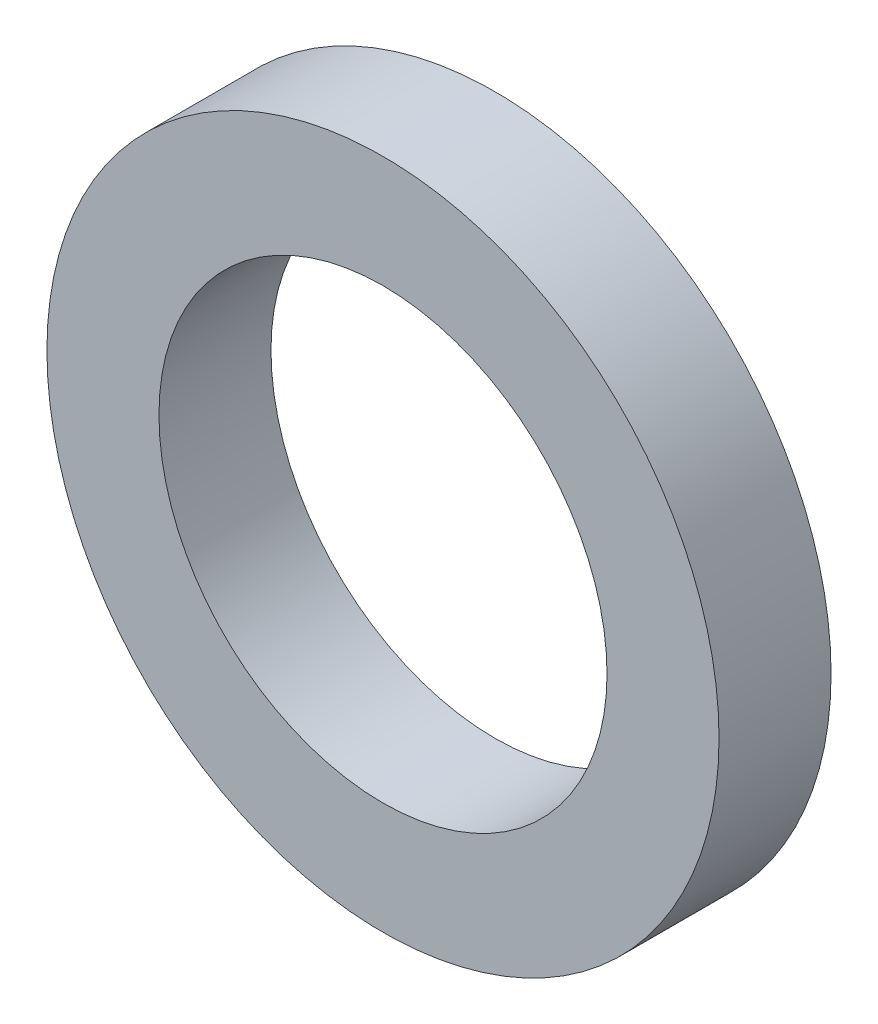
ISO-10303-21;
HEADER;
FILE_DESCRIPTION(('STEP AP214'),'2;1');
FILE_NAME('part.step','',(''),(''),'','','');
FILE_SCHEMA(('AUTOMOTIVE_DESIGN { 1 0 10303 214 1 1 1 1 }'));
ENDSEC;
DATA;
#1=APPLICATION_CONTEXT('core data for automotive mechanical design processes');
#2=APPLICATION_PROTOCOL_DEFINITION('international standard','automotive_design',2000,#1);
#3=PRODUCT_CONTEXT('',#1,'mechanical');
#4=PRODUCT('Part','Part','',(#3));
#5=PRODUCT_RELATED_PRODUCT_CATEGORY('part','',(#4));
#6=PRODUCT_DEFINITION_FORMATION('','',#4);
#7=PRODUCT_DEFINITION_CONTEXT('part definition',#1,'design');
#8=PRODUCT_DEFINITION('design','',#6,#7);
#9=PRODUCT_DEFINITION_SHAPE('','',#8);
#10=(LENGTH_UNIT() NAMED_UNIT(*) SI_UNIT(.MILLI.,.METRE.));
#11=(NAMED_UNIT(*) PLANE_ANGLE_UNIT() SI_UNIT($,.RADIAN.));
#12=(NAMED_UNIT(*) SI_UNIT($,.STERADIAN.) SOLID_ANGLE_UNIT());
#13=UNCERTAINTY_MEASURE_WITH_UNIT(LENGTH_MEASURE(1.E-05),#10,'distance_accuracy_value','');
#14=(GEOMETRIC_REPRESENTATION_CONTEXT(3) GLOBAL_UNCERTAINTY_ASSIGNED_CONTEXT((#13)) GLOBAL_UNIT_ASSIGNED_CONTEXT((#10,
#11,#12)) REPRESENTATION_CONTEXT('',''));
#15=CARTESIAN_POINT('',(0.,0.,0.));
#16=DIRECTION('',(0.,0.,1.));
#17=DIRECTION('',(1.,0.,0.));
#18=AXIS2_PLACEMENT_3D('',#15,#16,#17);
#19=CARTESIAN_POINT('',(0.,0.,6.35));
#20=DIRECTION('',(0.,0.,1.));
#21=DIRECTION('',(1.,0.,0.));
#22=AXIS2_PLACEMENT_3D('',#19,#20,#21);
#23=PLANE('',#22);
#24=CARTESIAN_POINT('',(0.,0.,6.35));
#25=DIRECTION('',(0.,0.,1.));
#26=DIRECTION('',(1.,0.,0.));
#27=AXIS2_PLACEMENT_3D('',#24,#25,#26);
#28=CIRCLE('',#27,19.05);
#29=CARTESIAN_POINT('',(19.05,0.,6.35));
#30=VERTEX_POINT('',#29);
#31=EDGE_CURVE('E10',#30,#30,#28,.T.);
#32=ORIENTED_EDGE('',*,*,#31,.T.);
#33=EDGE_LOOP('',(#32));
#34=FACE_BOUND('',#33,.T.);
#35=CARTESIAN_POINT('',(0.,0.,6.35));
#36=DIRECTION('',(0.,0.,1.));
#37=DIRECTION('',(1.,0.,0.));
#38=AXIS2_PLACEMENT_3D('',#35,#36,#37);
#39=CIRCLE('',#38,12.7);
#40=CARTESIAN_POINT('',(12.7,0.,6.35));
#41=VERTEX_POINT('',#40);
#42=EDGE_CURVE('E42',#41,#41,#39,.T.);
#43=ORIENTED_EDGE('',*,*,#42,.F.);
#44=EDGE_LOOP('',(#43));
#45=FACE_BOUND('',#44,.T.);
#46=ADVANCED_FACE('F31',(#34,#45),#23,.T.);
#47=CARTESIAN_POINT('',(0.,0.,0.));
#48=DIRECTION('',(0.,0.,1.));
#49=DIRECTION('',(1.,0.,0.));
#50=AXIS2_PLACEMENT_3D('',#47,#48,#49);
#51=PLANE('',#50);
#52=CARTESIAN_POINT('',(0.,0.,0.));
#53=DIRECTION('',(0.,0.,1.));
#54=DIRECTION('',(1.,0.,0.));
#55=AXIS2_PLACEMENT_3D('',#52,#53,#54);
#56=CIRCLE('',#55,19.05);
#57=CARTESIAN_POINT('',(19.05,0.,0.));
#58=VERTEX_POINT('',#57);
#59=EDGE_CURVE('E35',#58,#58,#56,.T.);
#60=ORIENTED_EDGE('',*,*,#59,.F.);
#61=EDGE_LOOP('',(#60));
#62=FACE_BOUND('',#61,.T.);
#63=CARTESIAN_POINT('',(0.,0.,0.));
#64=DIRECTION('',(0.,0.,1.));
#65=DIRECTION('',(1.,0.,0.));
#66=AXIS2_PLACEMENT_3D('',#63,#64,#65);
#67=CIRCLE('',#66,12.7);
#68=CARTESIAN_POINT('',(12.7,0.,0.));
#69=VERTEX_POINT('',#68);
#70=EDGE_CURVE('E44',#69,#69,#67,.T.);
#71=ORIENTED_EDGE('',*,*,#70,.T.);
#72=EDGE_LOOP('',(#71));
#73=FACE_BOUND('',#72,.T.);
#74=ADVANCED_FACE('F54',(#62,#73),#51,.F.);
#75=CARTESIAN_POINT('',(0.,0.,6.35));
#76=DIRECTION('',(0.,0.,-1.));
#77=DIRECTION('',(-1.,0.,0.));
#78=AXIS2_PLACEMENT_3D('',#75,#76,#77);
#79=CYLINDRICAL_SURFACE('',#78,19.05);
#80=ORIENTED_EDGE('',*,*,#31,.F.);
#81=EDGE_LOOP('',(#80));
#82=FACE_BOUND('',#81,.T.);
#83=ORIENTED_EDGE('',*,*,#59,.T.);
#84=EDGE_LOOP('',(#83));
#85=FACE_BOUND('',#84,.T.);
#86=ADVANCED_FACE('F33',(#82,#85),#79,.T.);
#87=CARTESIAN_POINT('',(0.,0.,6.35));
#88=DIRECTION('',(0.,0.,-1.));
#89=DIRECTION('',(-1.,0.,0.));
#90=AXIS2_PLACEMENT_3D('',#87,#88,#89);
#91=CYLINDRICAL_SURFACE('',#90,12.7);
#92=ORIENTED_EDGE('',*,*,#42,.T.);
#93=EDGE_LOOP('',(#92));
#94=FACE_BOUND('',#93,.T.);
#95=ORIENTED_EDGE('',*,*,#70,.F.);
#96=EDGE_LOOP('',(#95));
#97=FACE_BOUND('',#96,.T.);
#98=ADVANCED_FACE('F50',(#94,#97),#91,.F.);
#99=CLOSED_SHELL('',(#46,#74,#86,#98));
#100=MANIFOLD_SOLID_BREP('B2',#99);
#101=ADVANCED_BREP_SHAPE_REPRESENTATION('',(#18,#100),#14);
#102=SHAPE_DEFINITION_REPRESENTATION(#9,#101);
ENDSEC;
END-ISO-10303-21;
